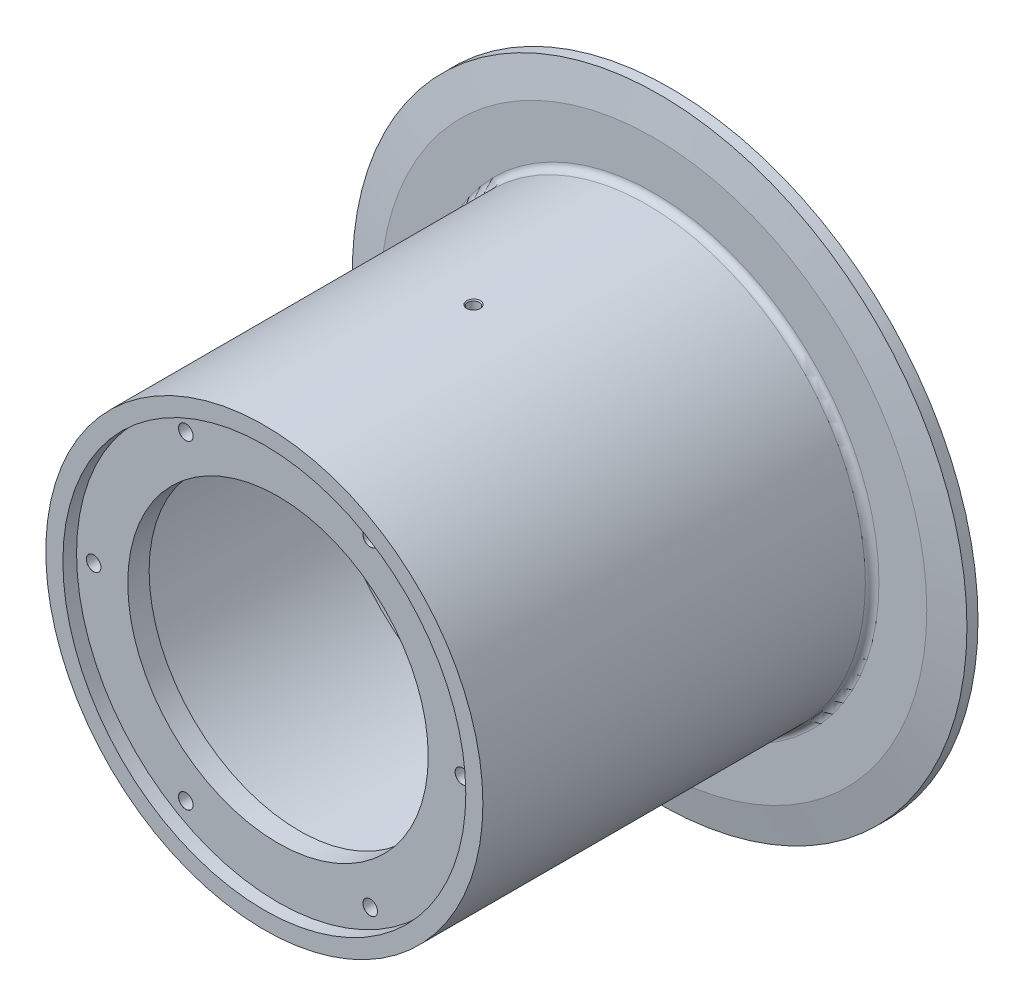
ISO-10303-21;
HEADER;
FILE_DESCRIPTION(('STEP AP214'),'2;1');
FILE_NAME('part.step','',(''),(''),'','','');
FILE_SCHEMA(('AUTOMOTIVE_DESIGN { 1 0 10303 214 1 1 1 1 }'));
ENDSEC;
DATA;
#1=APPLICATION_CONTEXT('core data for automotive mechanical design processes');
#2=APPLICATION_PROTOCOL_DEFINITION('international standard','automotive_design',2000,#1);
#3=PRODUCT_CONTEXT('',#1,'mechanical');
#4=PRODUCT('Part','Part','',(#3));
#5=PRODUCT_RELATED_PRODUCT_CATEGORY('part','',(#4));
#6=PRODUCT_DEFINITION_FORMATION('','',#4);
#7=PRODUCT_DEFINITION_CONTEXT('part definition',#1,'design');
#8=PRODUCT_DEFINITION('design','',#6,#7);
#9=PRODUCT_DEFINITION_SHAPE('','',#8);
#10=(LENGTH_UNIT() NAMED_UNIT(*) SI_UNIT(.MILLI.,.METRE.));
#11=(NAMED_UNIT(*) PLANE_ANGLE_UNIT() SI_UNIT($,.RADIAN.));
#12=(NAMED_UNIT(*) SI_UNIT($,.STERADIAN.) SOLID_ANGLE_UNIT());
#13=UNCERTAINTY_MEASURE_WITH_UNIT(LENGTH_MEASURE(1.E-05),#10,'distance_accuracy_value','');
#14=(GEOMETRIC_REPRESENTATION_CONTEXT(3) GLOBAL_UNCERTAINTY_ASSIGNED_CONTEXT((#13)) GLOBAL_UNIT_ASSIGNED_CONTEXT((#10,
#11,#12)) REPRESENTATION_CONTEXT('',''));
#15=CARTESIAN_POINT('',(0.,0.,0.));
#16=DIRECTION('',(0.,0.,1.));
#17=DIRECTION('',(1.,0.,0.));
#18=AXIS2_PLACEMENT_3D('',#15,#16,#17);
#19=CARTESIAN_POINT('',(0.,0.,238.));
#20=DIRECTION('',(0.,0.,-1.));
#21=DIRECTION('',(-1.,0.,0.));
#22=AXIS2_PLACEMENT_3D('',#19,#20,#21);
#23=CYLINDRICAL_SURFACE('',#22,88.);
#24=CARTESIAN_POINT('',(0.,0.,217.5));
#25=DIRECTION('',(0.,0.,-1.));
#26=DIRECTION('',(-1.,0.,0.));
#27=AXIS2_PLACEMENT_3D('',#24,#25,#26);
#28=CIRCLE('',#27,88.);
#29=CARTESIAN_POINT('',(-88.,0.,217.5));
#30=VERTEX_POINT('',#29);
#31=EDGE_CURVE('E76',#30,#30,#28,.T.);
#32=ORIENTED_EDGE('',*,*,#31,.T.);
#33=EDGE_LOOP('',(#32));
#34=FACE_BOUND('',#33,.T.);
#35=CARTESIAN_POINT('',(0.,0.,230.));
#36=DIRECTION('',(0.,0.,1.));
#37=DIRECTION('',(1.,0.,0.));
#38=AXIS2_PLACEMENT_3D('',#35,#36,#37);
#39=CIRCLE('',#38,88.);
#40=CARTESIAN_POINT('',(88.,0.,230.));
#41=VERTEX_POINT('',#40);
#42=EDGE_CURVE('E73',#41,#41,#39,.F.);
#43=ORIENTED_EDGE('',*,*,#42,.F.);
#44=EDGE_LOOP('',(#43));
#45=FACE_BOUND('',#44,.T.);
#46=ADVANCED_FACE('F43',(#34,#45),#23,.F.);
#47=CARTESIAN_POINT('',(0.,0.,10.));
#48=DIRECTION('',(0.,0.,-1.));
#49=DIRECTION('',(-1.,0.,0.));
#50=AXIS2_PLACEMENT_3D('',#47,#48,#49);
#51=CYLINDRICAL_SURFACE('',#50,180.);
#52=CARTESIAN_POINT('',(0.,0.,6.47346038583069));
#53=DIRECTION('',(0.,0.,1.));
#54=DIRECTION('',(1.,0.,0.));
#55=AXIS2_PLACEMENT_3D('',#52,#53,#54);
#56=CIRCLE('',#55,180.);
#57=CARTESIAN_POINT('',(180.,0.,6.47346038583069));
#58=VERTEX_POINT('',#57);
#59=EDGE_CURVE('E56',#58,#58,#56,.F.);
#60=ORIENTED_EDGE('',*,*,#59,.T.);
#61=EDGE_LOOP('',(#60));
#62=FACE_BOUND('',#61,.T.);
#63=CARTESIAN_POINT('',(0.,0.,0.));
#64=DIRECTION('',(0.,0.,1.));
#65=DIRECTION('',(1.,0.,0.));
#66=AXIS2_PLACEMENT_3D('',#63,#64,#65);
#67=CIRCLE('',#66,180.);
#68=CARTESIAN_POINT('',(180.,0.,0.));
#69=VERTEX_POINT('',#68);
#70=EDGE_CURVE('E72',#69,#69,#67,.T.);
#71=ORIENTED_EDGE('',*,*,#70,.T.);
#72=EDGE_LOOP('',(#71));
#73=FACE_BOUND('',#72,.T.);
#74=ADVANCED_FACE('F183',(#62,#73),#51,.T.);
#75=CARTESIAN_POINT('',(0.,0.,10.));
#76=DIRECTION('',(0.,0.,1.));
#77=DIRECTION('',(1.,0.,0.));
#78=AXIS2_PLACEMENT_3D('',#75,#76,#77);
#79=PLANE('',#78);
#80=CARTESIAN_POINT('',(0.,0.,10.));
#81=DIRECTION('',(0.,0.,1.));
#82=DIRECTION('',(1.,0.,0.));
#83=AXIS2_PLACEMENT_3D('',#80,#81,#82);
#84=CIRCLE('',#83,160.);
#85=CARTESIAN_POINT('',(160.,0.,10.));
#86=VERTEX_POINT('',#85);
#87=EDGE_CURVE('E60',#86,#86,#84,.T.);
#88=ORIENTED_EDGE('',*,*,#87,.T.);
#89=EDGE_LOOP('',(#88));
#90=FACE_BOUND('',#89,.T.);
#91=CARTESIAN_POINT('',(0.,0.,10.));
#92=DIRECTION('',(0.,0.,1.));
#93=DIRECTION('',(1.,0.,0.));
#94=AXIS2_PLACEMENT_3D('',#91,#92,#93);
#95=CIRCLE('',#94,132.);
#96=CARTESIAN_POINT('',(132.,0.,10.));
#97=VERTEX_POINT('',#96);
#98=EDGE_CURVE('E69',#97,#97,#95,.F.);
#99=ORIENTED_EDGE('',*,*,#98,.T.);
#100=EDGE_LOOP('',(#99));
#101=FACE_BOUND('',#100,.T.);
#102=ADVANCED_FACE('F191',(#90,#101),#79,.T.);
#103=CARTESIAN_POINT('',(0.,0.,0.));
#104=DIRECTION('',(0.,0.,1.));
#105=DIRECTION('',(1.,0.,0.));
#106=AXIS2_PLACEMENT_3D('',#103,#104,#105);
#107=PLANE('',#106);
#108=CARTESIAN_POINT('',(0.,0.,0.));
#109=DIRECTION('',(0.,0.,-1.));
#110=DIRECTION('',(-1.,0.,0.));
#111=AXIS2_PLACEMENT_3D('',#108,#109,#110);
#112=CIRCLE('',#111,120.);
#113=CARTESIAN_POINT('',(-120.,0.,0.));
#114=VERTEX_POINT('',#113);
#115=EDGE_CURVE('E84',#114,#114,#112,.T.);
#116=ORIENTED_EDGE('',*,*,#115,.F.);
#117=EDGE_LOOP('',(#116));
#118=FACE_BOUND('',#117,.T.);
#119=ORIENTED_EDGE('',*,*,#70,.F.);
#120=EDGE_LOOP('',(#119));
#121=FACE_BOUND('',#120,.T.);
#122=ADVANCED_FACE('F220',(#118,#121),#107,.F.);
#123=CARTESIAN_POINT('',(0.,0.,238.));
#124=DIRECTION('',(0.,0.,-1.));
#125=DIRECTION('',(-1.,0.,0.));
#126=AXIS2_PLACEMENT_3D('',#123,#124,#125);
#127=CYLINDRICAL_SURFACE('',#126,128.);
#128=CARTESIAN_POINT('',(-2.82414256295986,127.968840812067,112.675998722343));
#129=CARTESIAN_POINT('',(-2.68645974326533,127.971879152029,112.53401600314));
#130=CARTESIAN_POINT('',(-2.53819008875975,127.974928522801,112.402241359048));
#131=CARTESIAN_POINT('',(-2.22359844638859,127.980781259121,112.16217326656));
#132=CARTESIAN_POINT('',(-2.05726451929486,127.983584459727,112.053895491427));
#133=CARTESIAN_POINT('',(-1.68791152977042,127.989019788171,111.851284768109));
#134=CARTESIAN_POINT('',(-1.48292240458041,127.99158402794,111.760513739689));
#135=CARTESIAN_POINT('',(-1.06045908268999,127.995781306011,111.615153362954));
#136=CARTESIAN_POINT('',(-0.842982736314652,127.997414183446,111.560570264804));
#137=CARTESIAN_POINT('',(-0.404652854782647,127.99954559041,111.489777231778));
#138=CARTESIAN_POINT('',(-0.183875433855364,128.000058034061,111.473096502454));
#139=CARTESIAN_POINT('',(0.257306582838074,127.999931434429,111.477248951562));
#140=CARTESIAN_POINT('',(0.477711212809013,127.999292503249,111.498078477881));
#141=CARTESIAN_POINT('',(0.910654767185401,127.996942705384,111.576371550068));
#142=CARTESIAN_POINT('',(1.12323005730501,127.995237708457,111.633634523607));
#143=CARTESIAN_POINT('',(1.53582234771381,127.990952232172,111.782844587693));
#144=CARTESIAN_POINT('',(1.73583904143227,127.988371731453,111.874792524557));
#145=CARTESIAN_POINT('',(2.11881954197511,127.982606328028,112.091168980848));
#146=CARTESIAN_POINT('',(2.30168870438211,127.979418335281,112.215764836917));
#147=CARTESIAN_POINT('',(2.64425570835804,127.972799146615,112.493518312476));
#148=CARTESIAN_POINT('',(2.80395215651215,127.969367936088,112.64667764827));
#149=CARTESIAN_POINT('',(3.09790801317308,127.962591872895,112.979335267779));
#150=CARTESIAN_POINT('',(3.23180603436006,127.959248744851,113.159152878122));
#151=CARTESIAN_POINT('',(3.4680331767394,127.953064664639,113.538453674297));
#152=CARTESIAN_POINT('',(3.57035984928077,127.95022375143,113.737938383912));
#153=CARTESIAN_POINT('',(3.74209489095357,127.945317453477,114.154065262796));
#154=CARTESIAN_POINT('',(3.81099648665762,127.943264101129,114.370916779669));
#155=CARTESIAN_POINT('',(3.91184200009661,127.94022064489,114.813058461743));
#156=CARTESIAN_POINT('',(3.94378356218811,127.93923060877,115.03834916387));
#157=CARTESIAN_POINT('',(3.97002680244293,127.938419071298,115.493419951128));
#158=CARTESIAN_POINT('',(3.96394269821898,127.938609546442,115.723222392473));
#159=CARTESIAN_POINT('',(3.91338278689922,127.940165937699,116.17856687314));
#160=CARTESIAN_POINT('',(3.86890596845683,127.941531884776,116.404108800072));
#161=CARTESIAN_POINT('',(3.74259184489696,127.945288996916,116.844941427717));
#162=CARTESIAN_POINT('',(3.66068387256686,127.947682100652,117.060211883828));
#163=CARTESIAN_POINT('',(3.46164749467733,127.953221367772,117.473803093436));
#164=CARTESIAN_POINT('',(3.34451994252925,127.956367512908,117.672124257484));
#165=CARTESIAN_POINT('',(3.07916196404981,127.963026657433,118.044607326741));
#166=CARTESIAN_POINT('',(2.93115881610913,127.966536886731,118.21893111932));
#167=CARTESIAN_POINT('',(2.60761594977686,127.973538080331,118.539825002739));
#168=CARTESIAN_POINT('',(2.43207821806172,127.977029046004,118.68639709424));
#169=CARTESIAN_POINT('',(2.06100578142657,127.983538628569,118.945450330309));
#170=CARTESIAN_POINT('',(1.86577856663326,127.986563070297,119.05837171967));
#171=CARTESIAN_POINT('',(1.45891990124258,127.991846917981,119.249278178861));
#172=CARTESIAN_POINT('',(1.24728992307205,127.994106392507,119.327266380288));
#173=CARTESIAN_POINT('',(0.816969237259981,127.997570903468,119.444954569507));
#174=CARTESIAN_POINT('',(0.598427396678319,127.998790902994,119.485198760116));
#175=CARTESIAN_POINT('',(0.157685792268398,128.000092479042,119.528091234884));
#176=CARTESIAN_POINT('',(-0.0645137494156066,128.000174124445,119.530741793856));
#177=CARTESIAN_POINT('',(-0.50425372857295,127.999194052041,119.498506930646));
#178=CARTESIAN_POINT('',(-0.721817740649387,127.998142081027,119.463941492466));
#179=CARTESIAN_POINT('',(-1.14806599013302,127.995028794366,119.358854207547));
#180=CARTESIAN_POINT('',(-1.35675026438346,127.992967482908,119.28833251001));
#181=CARTESIAN_POINT('',(-1.75981036409411,127.988061209018,119.113320810844));
#182=CARTESIAN_POINT('',(-1.95415778844746,127.985214741384,119.008765494184));
#183=CARTESIAN_POINT('',(-2.32279521947459,127.979055564055,118.768859569011));
#184=CARTESIAN_POINT('',(-2.49708421445758,127.975742830863,118.633507408216));
#185=CARTESIAN_POINT('',(-2.82279737427129,127.968975544882,118.334271727613));
#186=CARTESIAN_POINT('',(-2.97394254927476,127.965519816639,118.17008464406));
#187=CARTESIAN_POINT('',(-3.24701274034007,127.958882527741,117.818984210553));
#188=CARTESIAN_POINT('',(-3.36893549003233,127.955700988363,117.6320690996));
#189=CARTESIAN_POINT('',(-3.58202146114274,127.949914818448,117.237818653396));
#190=CARTESIAN_POINT('',(-3.67269697635005,127.947319535526,117.03021955268));
#191=CARTESIAN_POINT('',(-3.81839262399146,127.94305460284,116.602861922996));
#192=CARTESIAN_POINT('',(-3.87341111511314,127.941384995686,116.383102834802));
#193=CARTESIAN_POINT('',(-3.94684069982964,127.93914115342,115.934817444891));
#194=CARTESIAN_POINT('',(-3.96480234688295,127.938580370107,115.706217376856));
#195=CARTESIAN_POINT('',(-3.96231011288011,127.938657554776,115.249182521649));
#196=CARTESIAN_POINT('',(-3.94184871356658,127.939295757365,115.020747775575));
#197=CARTESIAN_POINT('',(-3.86283523040071,127.941705703111,114.569396150286));
#198=CARTESIAN_POINT('',(-3.80409309855936,127.943483101174,114.346512593127));
#199=CARTESIAN_POINT('',(-3.64988221480003,127.947974849917,113.913960711648));
#200=CARTESIAN_POINT('',(-3.55444141507453,127.950688487333,113.70428247038));
#201=CARTESIAN_POINT('',(-3.35731615355405,127.955990637688,113.353697310402));
#202=CARTESIAN_POINT('',(-3.26299390604948,127.958444561939,113.208594363168));
#203=CARTESIAN_POINT('',(-3.05651532193945,127.963543166981,112.931735742695));
#204=CARTESIAN_POINT('',(-2.94436490378878,127.966187784308,112.799975663676));
#205=CARTESIAN_POINT('',(-2.82414256295986,127.968840812067,112.675998722343));
#206=B_SPLINE_CURVE_WITH_KNOTS('',3,(#128,#129,#130,#131,#132,#133,#134,#135,#136,#137,#138,
#139,#140,#141,#142,#143,#144,#145,#146,#147,#148,#149,#150,#151,#152,#153,#154,#155,#156,#157,
#158,#159,#160,#161,#162,#163,#164,#165,#166,#167,#168,#169,#170,#171,#172,#173,#174,#175,#176,
#177,#178,#179,#180,#181,#182,#183,#184,#185,#186,#187,#188,#189,#190,#191,#192,#193,#194,#195,
#196,#197,#198,#199,#200,#201,#202,#203,#204,#205),.UNSPECIFIED.,.T.,.F.,(4,2,2,2,2,2,2,2,2,2,2,
2,2,2,2,2,2,2,2,2,2,2,2,2,2,2,2,2,2,2,2,2,2,2,2,2,2,2,4),(0.,0.59291162400872,1.18621753408176,
1.85550872766651,2.52491548718907,3.18596083886011,3.84694183262189,4.50431513218082,
5.16170447279296,5.82253150579298,6.48339825899662,7.15293924445179,7.82253214597558,
8.50198227537521,9.18147570706494,9.86787392743202,10.5542902295547,11.2420078222479,
11.9297087520876,12.6125155971546,13.2952731989557,13.9686609255674,14.641988274039,
15.3054510306807,15.9688736406264,16.6266373452339,17.2843983204235,17.9434291430218,
18.6024931907281,19.2689643772155,19.935487235718,20.6119862576446,21.2885164169818,
21.9732048031165,22.6580271765424,23.3462755797075,24.0340008013263,24.5518929063465,
25.0696134433108),.UNSPECIFIED.);
#207=CARTESIAN_POINT('',(-2.82414256295986,127.968840812067,112.675998722343));
#208=VERTEX_POINT('',#207);
#209=EDGE_CURVE('E10',#208,#208,#206,.T.);
#210=ORIENTED_EDGE('',*,*,#209,.T.);
#211=EDGE_LOOP('',(#210));
#212=FACE_BOUND('',#211,.T.);
#213=CARTESIAN_POINT('',(0.,0.,14.));
#214=DIRECTION('',(0.,0.,1.));
#215=DIRECTION('',(1.,0.,0.));
#216=AXIS2_PLACEMENT_3D('',#213,#214,#215);
#217=CIRCLE('',#216,128.);
#218=CARTESIAN_POINT('',(128.,0.,14.));
#219=VERTEX_POINT('',#218);
#220=EDGE_CURVE('E64',#219,#219,#217,.T.);
#221=ORIENTED_EDGE('',*,*,#220,.T.);
#222=EDGE_LOOP('',(#221));
#223=FACE_BOUND('',#222,.T.);
#224=CARTESIAN_POINT('',(0.,0.,238.));
#225=DIRECTION('',(0.,0.,1.));
#226=DIRECTION('',(1.,0.,0.));
#227=AXIS2_PLACEMENT_3D('',#224,#225,#226);
#228=CIRCLE('',#227,128.);
#229=CARTESIAN_POINT('',(128.,0.,238.));
#230=VERTEX_POINT('',#229);
#231=EDGE_CURVE('E80',#230,#230,#228,.T.);
#232=ORIENTED_EDGE('',*,*,#231,.F.);
#233=EDGE_LOOP('',(#232));
#234=FACE_BOUND('',#233,.T.);
#235=ADVANCED_FACE('F215',(#212,#223,#234),#127,.T.);
#236=CARTESIAN_POINT('',(0.,0.,238.));
#237=DIRECTION('',(0.,0.,1.));
#238=DIRECTION('',(1.,0.,0.));
#239=AXIS2_PLACEMENT_3D('',#236,#237,#238);
#240=PLANE('',#239);
#241=CARTESIAN_POINT('',(0.,0.,238.));
#242=DIRECTION('',(0.,0.,1.));
#243=DIRECTION('',(1.,0.,0.));
#244=AXIS2_PLACEMENT_3D('',#241,#242,#243);
#245=CIRCLE('',#244,118.);
#246=CARTESIAN_POINT('',(118.,0.,238.));
#247=VERTEX_POINT('',#246);
#248=EDGE_CURVE('E97',#247,#247,#245,.T.);
#249=ORIENTED_EDGE('',*,*,#248,.F.);
#250=EDGE_LOOP('',(#249));
#251=FACE_BOUND('',#250,.T.);
#252=ORIENTED_EDGE('',*,*,#231,.T.);
#253=EDGE_LOOP('',(#252));
#254=FACE_BOUND('',#253,.T.);
#255=ADVANCED_FACE('F213',(#251,#254),#240,.T.);
#256=CARTESIAN_POINT('',(0.,0.,86.));
#257=DIRECTION('',(0.,0.,-1.));
#258=DIRECTION('',(-1.,0.,0.));
#259=AXIS2_PLACEMENT_3D('',#256,#257,#258);
#260=CYLINDRICAL_SURFACE('',#259,120.);
#261=CARTESIAN_POINT('',(0.,0.,86.));
#262=DIRECTION('',(0.,0.,-1.));
#263=DIRECTION('',(-1.,0.,0.));
#264=AXIS2_PLACEMENT_3D('',#261,#262,#263);
#265=CIRCLE('',#264,120.);
#266=CARTESIAN_POINT('',(-120.,0.,86.));
#267=VERTEX_POINT('',#266);
#268=EDGE_CURVE('E83',#267,#267,#265,.T.);
#269=ORIENTED_EDGE('',*,*,#268,.F.);
#270=EDGE_LOOP('',(#269));
#271=FACE_BOUND('',#270,.T.);
#272=ORIENTED_EDGE('',*,*,#115,.T.);
#273=EDGE_LOOP('',(#272));
#274=FACE_BOUND('',#273,.T.);
#275=ADVANCED_FACE('F209',(#271,#274),#260,.F.);
#276=CARTESIAN_POINT('',(0.,0.,86.));
#277=DIRECTION('',(0.,0.,-1.));
#278=DIRECTION('',(-1.,0.,0.));
#279=AXIS2_PLACEMENT_3D('',#276,#277,#278);
#280=PLANE('',#279);
#281=CARTESIAN_POINT('',(0.,0.,86.));
#282=DIRECTION('',(0.,0.,-1.));
#283=DIRECTION('',(-1.,0.,0.));
#284=AXIS2_PLACEMENT_3D('',#281,#282,#283);
#285=CIRCLE('',#284,118.);
#286=CARTESIAN_POINT('',(-118.,0.,86.));
#287=VERTEX_POINT('',#286);
#288=EDGE_CURVE('E90',#287,#287,#285,.T.);
#289=ORIENTED_EDGE('',*,*,#288,.F.);
#290=EDGE_LOOP('',(#289));
#291=FACE_BOUND('',#290,.T.);
#292=ORIENTED_EDGE('',*,*,#268,.T.);
#293=EDGE_LOOP('',(#292));
#294=FACE_BOUND('',#293,.T.);
#295=ADVANCED_FACE('F206',(#291,#294),#280,.T.);
#296=CARTESIAN_POINT('',(0.,0.,217.5));
#297=DIRECTION('',(0.,0.,-1.));
#298=DIRECTION('',(-1.,0.,0.));
#299=AXIS2_PLACEMENT_3D('',#296,#297,#298);
#300=CYLINDRICAL_SURFACE('',#299,118.);
#301=CARTESIAN_POINT('',(0.,118.,118.9));
#302=CARTESIAN_POINT('',(0.190936976262307,117.999999339873,118.899991545749));
#303=CARTESIAN_POINT('',(0.382011390885767,117.999531592533,118.883862074765));
#304=CARTESIAN_POINT('',(0.758895015322926,117.997710621914,118.819743874142));
#305=CARTESIAN_POINT('',(0.94469765497959,117.996356340327,118.771717065813));
#306=CARTESIAN_POINT('',(1.30552328051075,117.992915673774,118.645175154427));
#307=CARTESIAN_POINT('',(1.48055148177164,117.990829646339,118.566674938684));
#308=CARTESIAN_POINT('',(1.81489663743527,117.986160803312,118.381435828005));
#309=CARTESIAN_POINT('',(1.97421741964152,117.98357810921,118.274703836449));
#310=CARTESIAN_POINT('',(2.27274307660947,117.978205505375,118.035976585743));
#311=CARTESIAN_POINT('',(2.41194061277937,117.975415520605,117.903972150766));
#312=CARTESIAN_POINT('',(2.66620683066964,117.969943447507,117.618462872836));
#313=CARTESIAN_POINT('',(2.78127455246432,117.967261363474,117.464957174931));
#314=CARTESIAN_POINT('',(2.98402531273859,117.962307189255,117.140776795438));
#315=CARTESIAN_POINT('',(3.07170409061507,117.960035162879,116.970099448095));
#316=CARTESIAN_POINT('',(3.21716028937459,117.956157975387,116.61643970879));
#317=CARTESIAN_POINT('',(3.27493782555822,117.954552811699,116.433457364279));
#318=CARTESIAN_POINT('',(3.35893606980188,117.952190875568,116.060435919502));
#319=CARTESIAN_POINT('',(3.38516559255267,117.95143386615,115.870398805684));
#320=CARTESIAN_POINT('',(3.40535039639097,117.950852881271,115.488617355375));
#321=CARTESIAN_POINT('',(3.39930580083339,117.951028902243,115.296873025412));
#322=CARTESIAN_POINT('',(3.35512142493653,117.952293907882,114.917179867643));
#323=CARTESIAN_POINT('',(3.31699117915958,117.953382621333,114.729229929283));
#324=CARTESIAN_POINT('',(3.20973262505407,117.956349853686,114.362399985143));
#325=CARTESIAN_POINT('',(3.14060425123601,117.958228374257,114.183519998525));
#326=CARTESIAN_POINT('',(2.97330080641595,117.9625637678,113.839877080885));
#327=CARTESIAN_POINT('',(2.87512136469787,117.965020727787,113.675116278898));
#328=CARTESIAN_POINT('',(2.65250600407722,117.970235933248,113.364412073435));
#329=CARTESIAN_POINT('',(2.52807003065717,117.972994179347,113.218468709031));
#330=CARTESIAN_POINT('',(2.25641994623075,117.978502225383,112.94948662377));
#331=CARTESIAN_POINT('',(2.1091975655228,117.981252021881,112.826456254415));
#332=CARTESIAN_POINT('',(1.79618296582706,117.986432212473,112.606856857916));
#333=CARTESIAN_POINT('',(1.63039074388159,117.988862606516,112.510287834986));
#334=CARTESIAN_POINT('',(1.28493810008752,117.993130049133,112.346353333599));
#335=CARTESIAN_POINT('',(1.10527755423345,117.994967092401,112.278988116306));
#336=CARTESIAN_POINT('',(0.737190290299475,117.997840662933,112.175378817147));
#337=CARTESIAN_POINT('',(0.54876359426312,117.998877192211,112.139134657028));
#338=CARTESIAN_POINT('',(0.168565378453031,118.000032633991,112.098806547784));
#339=CARTESIAN_POINT('',(-0.0232049146852044,118.000151876195,112.094711043419));
#340=CARTESIAN_POINT('',(-0.404710359761766,117.999460175431,112.118766392123));
#341=CARTESIAN_POINT('',(-0.594445513868161,117.998649233454,112.146917210836));
#342=CARTESIAN_POINT('',(-0.966462547796877,117.996188773689,112.234656539367));
#343=CARTESIAN_POINT('',(-1.14874566566669,117.994539395811,112.294239804083));
#344=CARTESIAN_POINT('',(-1.50072224473422,117.990587931739,112.443147339309));
#345=CARTESIAN_POINT('',(-1.67041568272935,117.988285844342,112.532471664629));
#346=CARTESIAN_POINT('',(-1.99244909024461,117.983287489566,112.738355475534));
#347=CARTESIAN_POINT('',(-2.14478408560461,117.980591109703,112.854922738688));
#348=CARTESIAN_POINT('',(-2.427726408073,117.975108435382,113.111972078107));
#349=CARTESIAN_POINT('',(-2.55833368329061,117.972322140708,113.252454211485));
#350=CARTESIAN_POINT('',(-2.79415164939189,117.96697280778,113.553395008384));
#351=CARTESIAN_POINT('',(-2.89935488394806,117.964409835214,113.713859516027));
#352=CARTESIAN_POINT('',(-3.08132743053367,117.959797144689,114.050180185507));
#353=CARTESIAN_POINT('',(-3.1580968039844,117.957747425622,114.226036314096));
#354=CARTESIAN_POINT('',(-3.28100937174685,117.954392812326,114.588120219736));
#355=CARTESIAN_POINT('',(-3.32715739470308,117.95308780067,114.774346356531));
#356=CARTESIAN_POINT('',(-3.38753312200885,117.951369408858,115.151907274545));
#357=CARTESIAN_POINT('',(-3.40176084780144,117.950956028104,115.343242052332));
#358=CARTESIAN_POINT('',(-3.39789153869633,117.95106754826,115.725514238589));
#359=CARTESIAN_POINT('',(-3.37980626898816,117.951592107666,115.916451766358));
#360=CARTESIAN_POINT('',(-3.31184852654349,117.953519655826,116.29257929091));
#361=CARTESIAN_POINT('',(-3.26197599071216,117.954922646324,116.477769276283));
#362=CARTESIAN_POINT('',(-3.13186093325893,117.958448847088,116.837149596957));
#363=CARTESIAN_POINT('',(-3.05161789727552,117.960572069551,117.011339745904));
#364=CARTESIAN_POINT('',(-2.86304397670935,117.965299286222,117.343772013265));
#365=CARTESIAN_POINT('',(-2.75471411461249,117.967903262927,117.502014711946));
#366=CARTESIAN_POINT('',(-2.5130080608599,117.97329937676,117.79811355189));
#367=CARTESIAN_POINT('',(-2.37962542530588,117.976091562179,117.935964431769));
#368=CARTESIAN_POINT('',(-2.09157159085516,117.981549545757,118.187354535656));
#369=CARTESIAN_POINT('',(-1.93689512727622,117.984215312441,118.300887729567));
#370=CARTESIAN_POINT('',(-1.61058644179314,117.989120839137,118.500437511497));
#371=CARTESIAN_POINT('',(-1.43894351649799,117.991360327589,118.586436582584));
#372=CARTESIAN_POINT('',(-1.08378171384554,117.995155934954,118.72829678937));
#373=CARTESIAN_POINT('',(-0.900277298584589,117.996712868687,118.784193878542));
#374=CARTESIAN_POINT('',(-0.596344097734412,117.998551633342,118.849443624067));
#375=CARTESIAN_POINT('',(-0.477888249278073,117.999092415499,118.868378424988));
#376=CARTESIAN_POINT('',(-0.23963964960062,117.999816805953,118.89365926452));
#377=CARTESIAN_POINT('',(-0.119846898742148,118.000000414347,118.900005306546));
#378=CARTESIAN_POINT('',(0.,118.,118.9));
#379=B_SPLINE_CURVE_WITH_KNOTS('',3,(#301,#302,#303,#304,#305,#306,#307,#308,#309,#310,#311,
#312,#313,#314,#315,#316,#317,#318,#319,#320,#321,#322,#323,#324,#325,#326,#327,#328,#329,#330,
#331,#332,#333,#334,#335,#336,#337,#338,#339,#340,#341,#342,#343,#344,#345,#346,#347,#348,#349,
#350,#351,#352,#353,#354,#355,#356,#357,#358,#359,#360,#361,#362,#363,#364,#365,#366,#367,#368,
#369,#370,#371,#372,#373,#374,#375,#376,#377,#378),.UNSPECIFIED.,.T.,.F.,(4,2,2,2,2,2,2,2,2,2,2,
2,2,2,2,2,2,2,2,2,2,2,2,2,2,2,2,2,2,2,2,2,2,2,2,2,2,2,4),(0.,0.572373473255186,1.14543147079385,
1.71820986127992,2.29084832229733,2.86369509046343,3.43656464314178,4.00952326664145,
4.58247968076943,5.15527597046625,5.72807007087994,6.30069402005226,6.8733191790085,
7.44603053292505,8.01874307599666,8.59166395887283,9.16458493300004,9.73751103056986,
10.3104356875248,10.8831544078532,11.4558725179937,12.0284950894381,12.6011187161902,
13.1739060210226,13.7466946937826,14.3196512816738,14.8926066318881,15.4654716119669,
16.0383362072129,16.610992264469,17.1836494583985,17.7563163514108,18.3289623997173,
18.9017559422217,19.4746913572884,20.0479905471624,20.6206034675678,20.9798696801249,
21.3391357952312),.UNSPECIFIED.);
#380=CARTESIAN_POINT('',(0.,118.,118.9));
#381=VERTEX_POINT('',#380);
#382=EDGE_CURVE('E156',#381,#381,#379,.T.);
#383=ORIENTED_EDGE('',*,*,#382,.T.);
#384=EDGE_LOOP('',(#383));
#385=FACE_BOUND('',#384,.T.);
#386=CARTESIAN_POINT('',(0.,0.,217.5));
#387=DIRECTION('',(0.,0.,-1.));
#388=DIRECTION('',(-1.,0.,0.));
#389=AXIS2_PLACEMENT_3D('',#386,#387,#388);
#390=CIRCLE('',#389,118.);
#391=CARTESIAN_POINT('',(-118.,0.,217.5));
#392=VERTEX_POINT('',#391);
#393=EDGE_CURVE('E87',#392,#392,#390,.T.);
#394=ORIENTED_EDGE('',*,*,#393,.F.);
#395=EDGE_LOOP('',(#394));
#396=FACE_BOUND('',#395,.T.);
#397=ORIENTED_EDGE('',*,*,#288,.T.);
#398=EDGE_LOOP('',(#397));
#399=FACE_BOUND('',#398,.T.);
#400=ADVANCED_FACE('F202',(#385,#396,#399),#300,.F.);
#401=CARTESIAN_POINT('',(0.,0.,217.5));
#402=DIRECTION('',(0.,0.,-1.));
#403=DIRECTION('',(-1.,0.,0.));
#404=AXIS2_PLACEMENT_3D('',#401,#402,#403);
#405=PLANE('',#404);
#406=CARTESIAN_POINT('',(108.,0.,217.5));
#407=DIRECTION('',(0.,0.,-1.));
#408=DIRECTION('',(-1.,0.,0.));
#409=AXIS2_PLACEMENT_3D('',#406,#407,#408);
#410=CIRCLE('',#409,4.25);
#411=CARTESIAN_POINT('',(103.75,0.,217.5));
#412=VERTEX_POINT('',#411);
#413=EDGE_CURVE('E147',#412,#412,#410,.T.);
#414=ORIENTED_EDGE('',*,*,#413,.F.);
#415=EDGE_LOOP('',(#414));
#416=FACE_BOUND('',#415,.T.);
#417=CARTESIAN_POINT('',(53.9999999999998,-93.5307436087195,217.5));
#418=DIRECTION('',(0.,0.,-1.));
#419=DIRECTION('',(-1.,0.,0.));
#420=AXIS2_PLACEMENT_3D('',#417,#418,#419);
#421=CIRCLE('',#420,4.25);
#422=CARTESIAN_POINT('',(49.7499999999998,-93.5307436087195,217.5));
#423=VERTEX_POINT('',#422);
#424=EDGE_CURVE('E138',#423,#423,#421,.T.);
#425=ORIENTED_EDGE('',*,*,#424,.F.);
#426=EDGE_LOOP('',(#425));
#427=FACE_BOUND('',#426,.T.);
#428=CARTESIAN_POINT('',(-54.0000000000004,-93.5307436087191,217.5));
#429=DIRECTION('',(0.,0.,-1.));
#430=DIRECTION('',(-1.,0.,0.));
#431=AXIS2_PLACEMENT_3D('',#428,#429,#430);
#432=CIRCLE('',#431,4.25);
#433=CARTESIAN_POINT('',(-58.2500000000004,-93.5307436087191,217.5));
#434=VERTEX_POINT('',#433);
#435=EDGE_CURVE('E129',#434,#434,#432,.T.);
#436=ORIENTED_EDGE('',*,*,#435,.F.);
#437=EDGE_LOOP('',(#436));
#438=FACE_BOUND('',#437,.T.);
#439=CARTESIAN_POINT('',(-108.,7.54159969190117E-13,217.5));
#440=DIRECTION('',(0.,0.,-1.));
#441=DIRECTION('',(-1.,0.,0.));
#442=AXIS2_PLACEMENT_3D('',#439,#440,#441);
#443=CIRCLE('',#442,4.25);
#444=CARTESIAN_POINT('',(-112.25,7.54159969190117E-13,217.5));
#445=VERTEX_POINT('',#444);
#446=EDGE_CURVE('E120',#445,#445,#443,.T.);
#447=ORIENTED_EDGE('',*,*,#446,.F.);
#448=EDGE_LOOP('',(#447));
#449=FACE_BOUND('',#448,.T.);
#450=CARTESIAN_POINT('',(-53.9999999999991,93.5307436087198,217.5));
#451=DIRECTION('',(0.,0.,-1.));
#452=DIRECTION('',(-1.,0.,0.));
#453=AXIS2_PLACEMENT_3D('',#450,#451,#452);
#454=CIRCLE('',#453,4.25);
#455=CARTESIAN_POINT('',(-58.2499999999991,93.5307436087198,217.5));
#456=VERTEX_POINT('',#455);
#457=EDGE_CURVE('E111',#456,#456,#454,.T.);
#458=ORIENTED_EDGE('',*,*,#457,.F.);
#459=EDGE_LOOP('',(#458));
#460=FACE_BOUND('',#459,.T.);
#461=CARTESIAN_POINT('',(54.0000000000011,93.5307436087187,217.5));
#462=DIRECTION('',(0.,0.,-1.));
#463=DIRECTION('',(-1.,0.,0.));
#464=AXIS2_PLACEMENT_3D('',#461,#462,#463);
#465=CIRCLE('',#464,4.25);
#466=CARTESIAN_POINT('',(49.7500000000011,93.5307436087187,217.5));
#467=VERTEX_POINT('',#466);
#468=EDGE_CURVE('E100',#467,#467,#465,.T.);
#469=ORIENTED_EDGE('',*,*,#468,.F.);
#470=EDGE_LOOP('',(#469));
#471=FACE_BOUND('',#470,.T.);
#472=ORIENTED_EDGE('',*,*,#31,.F.);
#473=EDGE_LOOP('',(#472));
#474=FACE_BOUND('',#473,.T.);
#475=ORIENTED_EDGE('',*,*,#393,.T.);
#476=EDGE_LOOP('',(#475));
#477=FACE_BOUND('',#476,.T.);
#478=ADVANCED_FACE('F198',(#416,#427,#438,#449,#460,#471,#474,#477),#405,.T.);
#479=CARTESIAN_POINT('',(0.,0.,230.));
#480=DIRECTION('',(0.,0.,1.));
#481=DIRECTION('',(1.,0.,0.));
#482=AXIS2_PLACEMENT_3D('',#479,#480,#481);
#483=PLANE('',#482);
#484=CARTESIAN_POINT('',(108.,0.,230.));
#485=DIRECTION('',(0.,0.,1.));
#486=DIRECTION('',(1.,0.,0.));
#487=AXIS2_PLACEMENT_3D('',#484,#485,#486);
#488=CIRCLE('',#487,4.275);
#489=CARTESIAN_POINT('',(112.275,0.,230.));
#490=VERTEX_POINT('',#489);
#491=EDGE_CURVE('E153',#490,#490,#488,.T.);
#492=ORIENTED_EDGE('',*,*,#491,.F.);
#493=EDGE_LOOP('',(#492));
#494=FACE_BOUND('',#493,.T.);
#495=CARTESIAN_POINT('',(53.9999999999998,-93.5307436087195,230.));
#496=DIRECTION('',(0.,0.,1.));
#497=DIRECTION('',(1.,0.,0.));
#498=AXIS2_PLACEMENT_3D('',#495,#496,#497);
#499=CIRCLE('',#498,4.275);
#500=CARTESIAN_POINT('',(58.2749999999998,-93.5307436087195,230.));
#501=VERTEX_POINT('',#500);
#502=EDGE_CURVE('E144',#501,#501,#499,.T.);
#503=ORIENTED_EDGE('',*,*,#502,.F.);
#504=EDGE_LOOP('',(#503));
#505=FACE_BOUND('',#504,.T.);
#506=CARTESIAN_POINT('',(-54.0000000000004,-93.5307436087191,230.));
#507=DIRECTION('',(0.,0.,1.));
#508=DIRECTION('',(1.,0.,0.));
#509=AXIS2_PLACEMENT_3D('',#506,#507,#508);
#510=CIRCLE('',#509,4.275);
#511=CARTESIAN_POINT('',(-49.7250000000004,-93.5307436087191,230.));
#512=VERTEX_POINT('',#511);
#513=EDGE_CURVE('E135',#512,#512,#510,.T.);
#514=ORIENTED_EDGE('',*,*,#513,.F.);
#515=EDGE_LOOP('',(#514));
#516=FACE_BOUND('',#515,.T.);
#517=CARTESIAN_POINT('',(-108.,7.54159969190117E-13,230.));
#518=DIRECTION('',(0.,0.,1.));
#519=DIRECTION('',(1.,0.,0.));
#520=AXIS2_PLACEMENT_3D('',#517,#518,#519);
#521=CIRCLE('',#520,4.275);
#522=CARTESIAN_POINT('',(-103.725,7.54159969190117E-13,230.));
#523=VERTEX_POINT('',#522);
#524=EDGE_CURVE('E126',#523,#523,#521,.T.);
#525=ORIENTED_EDGE('',*,*,#524,.F.);
#526=EDGE_LOOP('',(#525));
#527=FACE_BOUND('',#526,.T.);
#528=CARTESIAN_POINT('',(-53.9999999999991,93.5307436087198,230.));
#529=DIRECTION('',(0.,0.,1.));
#530=DIRECTION('',(1.,0.,0.));
#531=AXIS2_PLACEMENT_3D('',#528,#529,#530);
#532=CIRCLE('',#531,4.275);
#533=CARTESIAN_POINT('',(-49.7249999999991,93.5307436087198,230.));
#534=VERTEX_POINT('',#533);
#535=EDGE_CURVE('E117',#534,#534,#532,.T.);
#536=ORIENTED_EDGE('',*,*,#535,.F.);
#537=EDGE_LOOP('',(#536));
#538=FACE_BOUND('',#537,.T.);
#539=CARTESIAN_POINT('',(54.0000000000011,93.5307436087187,230.));
#540=DIRECTION('',(0.,0.,1.));
#541=DIRECTION('',(1.,0.,0.));
#542=AXIS2_PLACEMENT_3D('',#539,#540,#541);
#543=CIRCLE('',#542,4.275);
#544=CARTESIAN_POINT('',(58.2750000000011,93.5307436087187,230.));
#545=VERTEX_POINT('',#544);
#546=EDGE_CURVE('E108',#545,#545,#543,.T.);
#547=ORIENTED_EDGE('',*,*,#546,.F.);
#548=EDGE_LOOP('',(#547));
#549=FACE_BOUND('',#548,.T.);
#550=CARTESIAN_POINT('',(0.,0.,230.));
#551=DIRECTION('',(0.,0.,1.));
#552=DIRECTION('',(1.,0.,0.));
#553=AXIS2_PLACEMENT_3D('',#550,#551,#552);
#554=CIRCLE('',#553,118.);
#555=CARTESIAN_POINT('',(118.,0.,230.));
#556=VERTEX_POINT('',#555);
#557=EDGE_CURVE('E77',#556,#556,#554,.T.);
#558=ORIENTED_EDGE('',*,*,#557,.T.);
#559=EDGE_LOOP('',(#558));
#560=FACE_BOUND('',#559,.T.);
#561=ORIENTED_EDGE('',*,*,#42,.T.);
#562=EDGE_LOOP('',(#561));
#563=FACE_BOUND('',#562,.T.);
#564=ADVANCED_FACE('F201',(#494,#505,#516,#527,#538,#549,#560,#563),#483,.T.);
#565=CARTESIAN_POINT('',(0.,0.,230.));
#566=DIRECTION('',(0.,0.,1.));
#567=DIRECTION('',(1.,0.,0.));
#568=AXIS2_PLACEMENT_3D('',#565,#566,#567);
#569=CYLINDRICAL_SURFACE('',#568,118.);
#570=ORIENTED_EDGE('',*,*,#557,.F.);
#571=EDGE_LOOP('',(#570));
#572=FACE_BOUND('',#571,.T.);
#573=ORIENTED_EDGE('',*,*,#248,.T.);
#574=EDGE_LOOP('',(#573));
#575=FACE_BOUND('',#574,.T.);
#576=ADVANCED_FACE('F196',(#572,#575),#569,.F.);
#577=CARTESIAN_POINT('',(54.0000000000011,93.5307436087187,230.));
#578=DIRECTION('',(0.,0.,1.));
#579=DIRECTION('',(1.,0.,0.));
#580=AXIS2_PLACEMENT_3D('',#577,#578,#579);
#581=CYLINDRICAL_SURFACE('',#580,4.25);
#582=CARTESIAN_POINT('',(54.0000000000011,93.5307436087187,229.975));
#583=DIRECTION('',(0.,0.,1.));
#584=DIRECTION('',(1.,0.,0.));
#585=AXIS2_PLACEMENT_3D('',#582,#583,#584);
#586=CIRCLE('',#585,4.25);
#587=CARTESIAN_POINT('',(58.2500000000011,93.5307436087187,229.975));
#588=VERTEX_POINT('',#587);
#589=EDGE_CURVE('E105',#588,#588,#586,.T.);
#590=ORIENTED_EDGE('',*,*,#589,.T.);
#591=EDGE_LOOP('',(#590));
#592=FACE_BOUND('',#591,.T.);
#593=ORIENTED_EDGE('',*,*,#468,.T.);
#594=EDGE_LOOP('',(#593));
#595=FACE_BOUND('',#594,.T.);
#596=ADVANCED_FACE('F285',(#592,#595),#581,.F.);
#597=CARTESIAN_POINT('',(54.0000000000011,93.5307436087187,230.));
#598=DIRECTION('',(0.,0.,1.));
#599=DIRECTION('',(1.,0.,0.));
#600=AXIS2_PLACEMENT_3D('',#597,#598,#599);
#601=CONICAL_SURFACE('',#600,4.275,0.785398163397587);
#602=ORIENTED_EDGE('',*,*,#589,.F.);
#603=EDGE_LOOP('',(#602));
#604=FACE_BOUND('',#603,.T.);
#605=ORIENTED_EDGE('',*,*,#546,.T.);
#606=EDGE_LOOP('',(#605));
#607=FACE_BOUND('',#606,.T.);
#608=ADVANCED_FACE('F281',(#604,#607),#601,.F.);
#609=CARTESIAN_POINT('',(-53.9999999999991,93.5307436087198,230.));
#610=DIRECTION('',(0.,0.,1.));
#611=DIRECTION('',(1.,0.,0.));
#612=AXIS2_PLACEMENT_3D('',#609,#610,#611);
#613=CYLINDRICAL_SURFACE('',#612,4.25);
#614=CARTESIAN_POINT('',(-53.9999999999991,93.5307436087198,229.975));
#615=DIRECTION('',(0.,0.,1.));
#616=DIRECTION('',(1.,0.,0.));
#617=AXIS2_PLACEMENT_3D('',#614,#615,#616);
#618=CIRCLE('',#617,4.25);
#619=CARTESIAN_POINT('',(-49.7499999999991,93.5307436087198,229.975));
#620=VERTEX_POINT('',#619);
#621=EDGE_CURVE('E114',#620,#620,#618,.T.);
#622=ORIENTED_EDGE('',*,*,#621,.T.);
#623=EDGE_LOOP('',(#622));
#624=FACE_BOUND('',#623,.T.);
#625=ORIENTED_EDGE('',*,*,#457,.T.);
#626=EDGE_LOOP('',(#625));
#627=FACE_BOUND('',#626,.T.);
#628=ADVANCED_FACE('F277',(#624,#627),#613,.F.);
#629=CARTESIAN_POINT('',(-53.9999999999991,93.5307436087198,230.));
#630=DIRECTION('',(0.,0.,1.));
#631=DIRECTION('',(1.,0.,0.));
#632=AXIS2_PLACEMENT_3D('',#629,#630,#631);
#633=CONICAL_SURFACE('',#632,4.275,0.785398163397587);
#634=ORIENTED_EDGE('',*,*,#621,.F.);
#635=EDGE_LOOP('',(#634));
#636=FACE_BOUND('',#635,.T.);
#637=ORIENTED_EDGE('',*,*,#535,.T.);
#638=EDGE_LOOP('',(#637));
#639=FACE_BOUND('',#638,.T.);
#640=ADVANCED_FACE('F273',(#636,#639),#633,.F.);
#641=CARTESIAN_POINT('',(-108.,7.54159969190117E-13,230.));
#642=DIRECTION('',(0.,0.,1.));
#643=DIRECTION('',(1.,0.,0.));
#644=AXIS2_PLACEMENT_3D('',#641,#642,#643);
#645=CYLINDRICAL_SURFACE('',#644,4.25);
#646=CARTESIAN_POINT('',(-108.,7.54159969190117E-13,229.975));
#647=DIRECTION('',(0.,0.,1.));
#648=DIRECTION('',(1.,0.,0.));
#649=AXIS2_PLACEMENT_3D('',#646,#647,#648);
#650=CIRCLE('',#649,4.25);
#651=CARTESIAN_POINT('',(-103.75,7.54159969190117E-13,229.975));
#652=VERTEX_POINT('',#651);
#653=EDGE_CURVE('E123',#652,#652,#650,.T.);
#654=ORIENTED_EDGE('',*,*,#653,.T.);
#655=EDGE_LOOP('',(#654));
#656=FACE_BOUND('',#655,.T.);
#657=ORIENTED_EDGE('',*,*,#446,.T.);
#658=EDGE_LOOP('',(#657));
#659=FACE_BOUND('',#658,.T.);
#660=ADVANCED_FACE('F269',(#656,#659),#645,.F.);
#661=CARTESIAN_POINT('',(-108.,7.54159969190117E-13,230.));
#662=DIRECTION('',(0.,0.,1.));
#663=DIRECTION('',(1.,0.,0.));
#664=AXIS2_PLACEMENT_3D('',#661,#662,#663);
#665=CONICAL_SURFACE('',#664,4.275,0.785398163397448);
#666=ORIENTED_EDGE('',*,*,#653,.F.);
#667=EDGE_LOOP('',(#666));
#668=FACE_BOUND('',#667,.T.);
#669=ORIENTED_EDGE('',*,*,#524,.T.);
#670=EDGE_LOOP('',(#669));
#671=FACE_BOUND('',#670,.T.);
#672=ADVANCED_FACE('F265',(#668,#671),#665,.F.);
#673=CARTESIAN_POINT('',(-54.0000000000004,-93.5307436087191,230.));
#674=DIRECTION('',(0.,0.,1.));
#675=DIRECTION('',(1.,0.,0.));
#676=AXIS2_PLACEMENT_3D('',#673,#674,#675);
#677=CYLINDRICAL_SURFACE('',#676,4.25);
#678=CARTESIAN_POINT('',(-54.0000000000004,-93.5307436087191,229.975));
#679=DIRECTION('',(0.,0.,1.));
#680=DIRECTION('',(1.,0.,0.));
#681=AXIS2_PLACEMENT_3D('',#678,#679,#680);
#682=CIRCLE('',#681,4.25);
#683=CARTESIAN_POINT('',(-49.7500000000004,-93.5307436087191,229.975));
#684=VERTEX_POINT('',#683);
#685=EDGE_CURVE('E132',#684,#684,#682,.T.);
#686=ORIENTED_EDGE('',*,*,#685,.T.);
#687=EDGE_LOOP('',(#686));
#688=FACE_BOUND('',#687,.T.);
#689=ORIENTED_EDGE('',*,*,#435,.T.);
#690=EDGE_LOOP('',(#689));
#691=FACE_BOUND('',#690,.T.);
#692=ADVANCED_FACE('F261',(#688,#691),#677,.F.);
#693=CARTESIAN_POINT('',(-54.0000000000004,-93.5307436087191,230.));
#694=DIRECTION('',(0.,0.,1.));
#695=DIRECTION('',(1.,0.,0.));
#696=AXIS2_PLACEMENT_3D('',#693,#694,#695);
#697=CONICAL_SURFACE('',#696,4.275,0.785398163397587);
#698=ORIENTED_EDGE('',*,*,#685,.F.);
#699=EDGE_LOOP('',(#698));
#700=FACE_BOUND('',#699,.T.);
#701=ORIENTED_EDGE('',*,*,#513,.T.);
#702=EDGE_LOOP('',(#701));
#703=FACE_BOUND('',#702,.T.);
#704=ADVANCED_FACE('F257',(#700,#703),#697,.F.);
#705=CARTESIAN_POINT('',(53.9999999999998,-93.5307436087195,230.));
#706=DIRECTION('',(0.,0.,1.));
#707=DIRECTION('',(1.,0.,0.));
#708=AXIS2_PLACEMENT_3D('',#705,#706,#707);
#709=CYLINDRICAL_SURFACE('',#708,4.25);
#710=CARTESIAN_POINT('',(53.9999999999998,-93.5307436087195,229.975));
#711=DIRECTION('',(0.,0.,1.));
#712=DIRECTION('',(1.,0.,0.));
#713=AXIS2_PLACEMENT_3D('',#710,#711,#712);
#714=CIRCLE('',#713,4.25);
#715=CARTESIAN_POINT('',(58.2499999999998,-93.5307436087195,229.975));
#716=VERTEX_POINT('',#715);
#717=EDGE_CURVE('E141',#716,#716,#714,.T.);
#718=ORIENTED_EDGE('',*,*,#717,.T.);
#719=EDGE_LOOP('',(#718));
#720=FACE_BOUND('',#719,.T.);
#721=ORIENTED_EDGE('',*,*,#424,.T.);
#722=EDGE_LOOP('',(#721));
#723=FACE_BOUND('',#722,.T.);
#724=ADVANCED_FACE('F253',(#720,#723),#709,.F.);
#725=CARTESIAN_POINT('',(53.9999999999998,-93.5307436087195,230.));
#726=DIRECTION('',(0.,0.,1.));
#727=DIRECTION('',(1.,0.,0.));
#728=AXIS2_PLACEMENT_3D('',#725,#726,#727);
#729=CONICAL_SURFACE('',#728,4.275,0.785398163397587);
#730=ORIENTED_EDGE('',*,*,#717,.F.);
#731=EDGE_LOOP('',(#730));
#732=FACE_BOUND('',#731,.T.);
#733=ORIENTED_EDGE('',*,*,#502,.T.);
#734=EDGE_LOOP('',(#733));
#735=FACE_BOUND('',#734,.T.);
#736=ADVANCED_FACE('F245',(#732,#735),#729,.F.);
#737=CARTESIAN_POINT('',(108.,0.,230.));
#738=DIRECTION('',(0.,0.,1.));
#739=DIRECTION('',(1.,0.,0.));
#740=AXIS2_PLACEMENT_3D('',#737,#738,#739);
#741=CYLINDRICAL_SURFACE('',#740,4.25);
#742=CARTESIAN_POINT('',(108.,0.,229.975));
#743=DIRECTION('',(0.,0.,1.));
#744=DIRECTION('',(1.,0.,0.));
#745=AXIS2_PLACEMENT_3D('',#742,#743,#744);
#746=CIRCLE('',#745,4.25);
#747=CARTESIAN_POINT('',(112.25,0.,229.975));
#748=VERTEX_POINT('',#747);
#749=EDGE_CURVE('E150',#748,#748,#746,.T.);
#750=ORIENTED_EDGE('',*,*,#749,.T.);
#751=EDGE_LOOP('',(#750));
#752=FACE_BOUND('',#751,.T.);
#753=ORIENTED_EDGE('',*,*,#413,.T.);
#754=EDGE_LOOP('',(#753));
#755=FACE_BOUND('',#754,.T.);
#756=ADVANCED_FACE('F232',(#752,#755),#741,.F.);
#757=CARTESIAN_POINT('',(108.,0.,230.));
#758=DIRECTION('',(0.,0.,1.));
#759=DIRECTION('',(1.,0.,0.));
#760=AXIS2_PLACEMENT_3D('',#757,#758,#759);
#761=CONICAL_SURFACE('',#760,4.275,0.785398163397448);
#762=ORIENTED_EDGE('',*,*,#749,.F.);
#763=EDGE_LOOP('',(#762));
#764=FACE_BOUND('',#763,.T.);
#765=ORIENTED_EDGE('',*,*,#491,.T.);
#766=EDGE_LOOP('',(#765));
#767=FACE_BOUND('',#766,.T.);
#768=ADVANCED_FACE('F227',(#764,#767),#761,.F.);
#769=CARTESIAN_POINT('',(0.,0.,14.));
#770=DIRECTION('',(0.,0.,1.));
#771=DIRECTION('',(1.,0.,0.));
#772=AXIS2_PLACEMENT_3D('',#769,#770,#771);
#773=TOROIDAL_SURFACE('',#772,132.,4.);
#774=ORIENTED_EDGE('',*,*,#220,.F.);
#775=EDGE_LOOP('',(#774));
#776=FACE_BOUND('',#775,.T.);
#777=ORIENTED_EDGE('',*,*,#98,.F.);
#778=EDGE_LOOP('',(#777));
#779=FACE_BOUND('',#778,.T.);
#780=ADVANCED_FACE('F178',(#776,#779),#773,.F.);
#781=CARTESIAN_POINT('',(0.,0.,10.));
#782=DIRECTION('',(0.,0.,-1.));
#783=DIRECTION('',(-1.,0.,0.));
#784=AXIS2_PLACEMENT_3D('',#781,#782,#783);
#785=CONICAL_SURFACE('',#784,160.,1.39626340159547);
#786=ORIENTED_EDGE('',*,*,#59,.F.);
#787=EDGE_LOOP('',(#786));
#788=FACE_BOUND('',#787,.T.);
#789=ORIENTED_EDGE('',*,*,#87,.F.);
#790=EDGE_LOOP('',(#789));
#791=FACE_BOUND('',#790,.T.);
#792=ADVANCED_FACE('F46',(#788,#791),#785,.T.);
#793=CARTESIAN_POINT('',(0.,128.,115.5));
#794=DIRECTION('',(0.,1.,0.));
#795=DIRECTION('',(0.,0.,1.));
#796=AXIS2_PLACEMENT_3D('',#793,#794,#795);
#797=CONICAL_SURFACE('',#796,4.025,0.785398163397445);
#798=CARTESIAN_POINT('',(0.,127.375,115.5));
#799=DIRECTION('',(0.,1.,0.));
#800=DIRECTION('',(0.,0.,1.));
#801=AXIS2_PLACEMENT_3D('',#798,#799,#800);
#802=CIRCLE('',#801,3.39999999999999);
#803=CARTESIAN_POINT('',(0.,127.375,118.9));
#804=VERTEX_POINT('',#803);
#805=EDGE_CURVE('E164',#804,#804,#802,.T.);
#806=ORIENTED_EDGE('',*,*,#805,.F.);
#807=EDGE_LOOP('',(#806));
#808=FACE_BOUND('',#807,.T.);
#809=ORIENTED_EDGE('',*,*,#209,.F.);
#810=EDGE_LOOP('',(#809));
#811=FACE_BOUND('',#810,.T.);
#812=ADVANCED_FACE('F170',(#808,#811),#797,.F.);
#813=CARTESIAN_POINT('',(0.,128.,115.5));
#814=DIRECTION('',(0.,1.,0.));
#815=DIRECTION('',(0.,0.,1.));
#816=AXIS2_PLACEMENT_3D('',#813,#814,#815);
#817=CYLINDRICAL_SURFACE('',#816,3.39999999999999);
#818=ORIENTED_EDGE('',*,*,#382,.F.);
#819=EDGE_LOOP('',(#818));
#820=FACE_BOUND('',#819,.T.);
#821=ORIENTED_EDGE('',*,*,#805,.T.);
#822=EDGE_LOOP('',(#821));
#823=FACE_BOUND('',#822,.T.);
#824=ADVANCED_FACE('F167',(#820,#823),#817,.F.);
#825=CLOSED_SHELL('',(#46,#74,#102,#122,#235,#255,#275,#295,#400,#478,#564,#576,#596,#608,#628,
#640,#660,#672,#692,#704,#724,#736,#756,#768,#780,#792,#812,#824));
#826=MANIFOLD_SOLID_BREP('B2',#825);
#827=ADVANCED_BREP_SHAPE_REPRESENTATION('',(#18,#826),#14);
#828=SHAPE_DEFINITION_REPRESENTATION(#9,#827);
ENDSEC;
END-ISO-10303-21;
